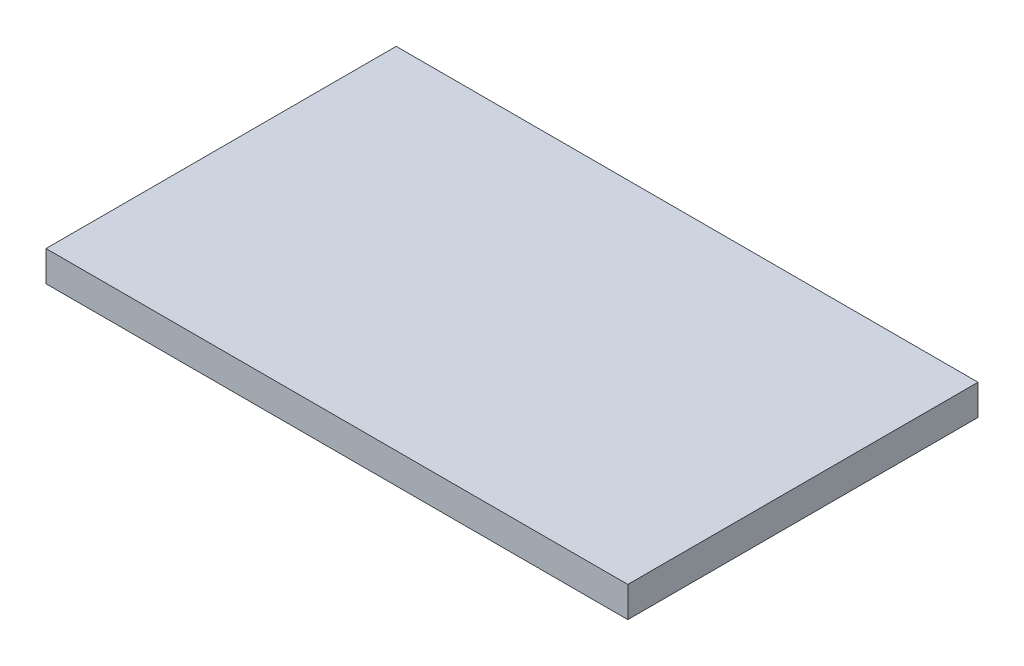
ISO-10303-21;
HEADER;
FILE_DESCRIPTION(('STEP AP214'),'2;1');
FILE_NAME('part.step','',(''),(''),'','','');
FILE_SCHEMA(('AUTOMOTIVE_DESIGN { 1 0 10303 214 1 1 1 1 }'));
ENDSEC;
DATA;
#1=APPLICATION_CONTEXT('core data for automotive mechanical design processes');
#2=APPLICATION_PROTOCOL_DEFINITION('international standard','automotive_design',2000,#1);
#3=PRODUCT_CONTEXT('',#1,'mechanical');
#4=PRODUCT('Part','Part','',(#3));
#5=PRODUCT_RELATED_PRODUCT_CATEGORY('part','',(#4));
#6=PRODUCT_DEFINITION_FORMATION('','',#4);
#7=PRODUCT_DEFINITION_CONTEXT('part definition',#1,'design');
#8=PRODUCT_DEFINITION('design','',#6,#7);
#9=PRODUCT_DEFINITION_SHAPE('','',#8);
#10=(LENGTH_UNIT() NAMED_UNIT(*) SI_UNIT(.MILLI.,.METRE.));
#11=(NAMED_UNIT(*) PLANE_ANGLE_UNIT() SI_UNIT($,.RADIAN.));
#12=(NAMED_UNIT(*) SI_UNIT($,.STERADIAN.) SOLID_ANGLE_UNIT());
#13=UNCERTAINTY_MEASURE_WITH_UNIT(LENGTH_MEASURE(1.E-05),#10,'distance_accuracy_value','');
#14=(GEOMETRIC_REPRESENTATION_CONTEXT(3) GLOBAL_UNCERTAINTY_ASSIGNED_CONTEXT((#13)) GLOBAL_UNIT_ASSIGNED_CONTEXT((#10,
#11,#12)) REPRESENTATION_CONTEXT('',''));
#15=CARTESIAN_POINT('',(0.,0.,0.));
#16=DIRECTION('',(0.,0.,1.));
#17=DIRECTION('',(1.,0.,0.));
#18=AXIS2_PLACEMENT_3D('',#15,#16,#17);
#19=CARTESIAN_POINT('',(-95.3262209228999,10.,57.3782998715129));
#20=DIRECTION('',(1.,0.,0.));
#21=DIRECTION('',(0.,0.,-1.));
#22=AXIS2_PLACEMENT_3D('',#19,#20,#21);
#23=PLANE('',#22);
#24=DIRECTION('',(0.,0.,1.));
#25=VECTOR('',#24,1.);
#26=CARTESIAN_POINT('',(-95.3262209228999,0.,57.3782998715129));
#27=LINE('',#26,#25);
#28=CARTESIAN_POINT('',(-95.3262209228999,0.,-57.3782998715129));
#29=VERTEX_POINT('',#28);
#30=CARTESIAN_POINT('',(-95.3262209228999,0.,57.3782998715129));
#31=VERTEX_POINT('',#30);
#32=EDGE_CURVE('E96',#29,#31,#27,.T.);
#33=ORIENTED_EDGE('',*,*,#32,.T.);
#34=DIRECTION('',(0.,-1.,0.));
#35=VECTOR('',#34,1.);
#36=CARTESIAN_POINT('',(-95.3262209228999,10.,57.3782998715129));
#37=LINE('',#36,#35);
#38=CARTESIAN_POINT('',(-95.3262209228999,10.,57.3782998715129));
#39=VERTEX_POINT('',#38);
#40=EDGE_CURVE('E11',#39,#31,#37,.T.);
#41=ORIENTED_EDGE('',*,*,#40,.F.);
#42=DIRECTION('',(0.,0.,1.));
#43=VECTOR('',#42,1.);
#44=CARTESIAN_POINT('',(-95.3262209228999,10.,57.3782998715129));
#45=LINE('',#44,#43);
#46=CARTESIAN_POINT('',(-95.3262209228999,10.,-57.3782998715129));
#47=VERTEX_POINT('',#46);
#48=EDGE_CURVE('E84',#47,#39,#45,.T.);
#49=ORIENTED_EDGE('',*,*,#48,.F.);
#50=DIRECTION('',(0.,-1.,0.));
#51=VECTOR('',#50,1.);
#52=CARTESIAN_POINT('',(-95.3262209228999,10.,-57.3782998715129));
#53=LINE('',#52,#51);
#54=EDGE_CURVE('E92',#47,#29,#53,.T.);
#55=ORIENTED_EDGE('',*,*,#54,.T.);
#56=EDGE_LOOP('',(#33,#41,#49,#55));
#57=FACE_BOUND('',#56,.T.);
#58=ADVANCED_FACE('F33',(#57),#23,.F.);
#59=CARTESIAN_POINT('',(95.3262209228999,10.,57.3782998715129));
#60=DIRECTION('',(0.,0.,-1.));
#61=DIRECTION('',(-1.,0.,0.));
#62=AXIS2_PLACEMENT_3D('',#59,#60,#61);
#63=PLANE('',#62);
#64=DIRECTION('',(1.,0.,0.));
#65=VECTOR('',#64,1.);
#66=CARTESIAN_POINT('',(95.3262209228999,0.,57.3782998715129));
#67=LINE('',#66,#65);
#68=CARTESIAN_POINT('',(95.3262209228999,0.,57.3782998715129));
#69=VERTEX_POINT('',#68);
#70=EDGE_CURVE('E88',#31,#69,#67,.T.);
#71=ORIENTED_EDGE('',*,*,#70,.T.);
#72=DIRECTION('',(0.,-1.,0.));
#73=VECTOR('',#72,1.);
#74=CARTESIAN_POINT('',(95.3262209228999,10.,57.3782998715129));
#75=LINE('',#74,#73);
#76=CARTESIAN_POINT('',(95.3262209228999,10.,57.3782998715129));
#77=VERTEX_POINT('',#76);
#78=EDGE_CURVE('E41',#77,#69,#75,.T.);
#79=ORIENTED_EDGE('',*,*,#78,.F.);
#80=DIRECTION('',(1.,0.,0.));
#81=VECTOR('',#80,1.);
#82=CARTESIAN_POINT('',(95.3262209228999,10.,57.3782998715129));
#83=LINE('',#82,#81);
#84=EDGE_CURVE('E79',#39,#77,#83,.T.);
#85=ORIENTED_EDGE('',*,*,#84,.F.);
#86=ORIENTED_EDGE('',*,*,#40,.T.);
#87=EDGE_LOOP('',(#71,#79,#85,#86));
#88=FACE_BOUND('',#87,.T.);
#89=ADVANCED_FACE('F87',(#88),#63,.F.);
#90=CARTESIAN_POINT('',(95.3262209228999,10.,57.3782998715129));
#91=DIRECTION('',(-1.,0.,0.));
#92=DIRECTION('',(0.,0.,1.));
#93=AXIS2_PLACEMENT_3D('',#90,#91,#92);
#94=PLANE('',#93);
#95=DIRECTION('',(0.,0.,-1.));
#96=VECTOR('',#95,1.);
#97=CARTESIAN_POINT('',(95.3262209228999,0.,57.3782998715129));
#98=LINE('',#97,#96);
#99=CARTESIAN_POINT('',(95.3262209228999,0.,-57.3782998715129));
#100=VERTEX_POINT('',#99);
#101=EDGE_CURVE('E66',#69,#100,#98,.T.);
#102=ORIENTED_EDGE('',*,*,#101,.T.);
#103=DIRECTION('',(0.,-1.,0.));
#104=VECTOR('',#103,1.);
#105=CARTESIAN_POINT('',(95.3262209228999,10.,-57.3782998715129));
#106=LINE('',#105,#104);
#107=CARTESIAN_POINT('',(95.3262209228999,10.,-57.3782998715129));
#108=VERTEX_POINT('',#107);
#109=EDGE_CURVE('E89',#108,#100,#106,.T.);
#110=ORIENTED_EDGE('',*,*,#109,.F.);
#111=DIRECTION('',(0.,0.,-1.));
#112=VECTOR('',#111,1.);
#113=CARTESIAN_POINT('',(95.3262209228999,10.,57.3782998715129));
#114=LINE('',#113,#112);
#115=EDGE_CURVE('E82',#77,#108,#114,.T.);
#116=ORIENTED_EDGE('',*,*,#115,.F.);
#117=ORIENTED_EDGE('',*,*,#78,.T.);
#118=EDGE_LOOP('',(#102,#110,#116,#117));
#119=FACE_BOUND('',#118,.T.);
#120=ADVANCED_FACE('F90',(#119),#94,.F.);
#121=CARTESIAN_POINT('',(95.3262209228999,10.,-57.3782998715129));
#122=DIRECTION('',(0.,0.,1.));
#123=DIRECTION('',(1.,0.,0.));
#124=AXIS2_PLACEMENT_3D('',#121,#122,#123);
#125=PLANE('',#124);
#126=DIRECTION('',(-1.,0.,0.));
#127=VECTOR('',#126,1.);
#128=CARTESIAN_POINT('',(95.3262209228999,0.,-57.3782998715129));
#129=LINE('',#128,#127);
#130=EDGE_CURVE('E72',#100,#29,#129,.T.);
#131=ORIENTED_EDGE('',*,*,#130,.T.);
#132=ORIENTED_EDGE('',*,*,#54,.F.);
#133=DIRECTION('',(-1.,0.,0.));
#134=VECTOR('',#133,1.);
#135=CARTESIAN_POINT('',(95.3262209228999,10.,-57.3782998715129));
#136=LINE('',#135,#134);
#137=EDGE_CURVE('E49',#108,#47,#136,.T.);
#138=ORIENTED_EDGE('',*,*,#137,.F.);
#139=ORIENTED_EDGE('',*,*,#109,.T.);
#140=EDGE_LOOP('',(#131,#132,#138,#139));
#141=FACE_BOUND('',#140,.T.);
#142=ADVANCED_FACE('F103',(#141),#125,.F.);
#143=CARTESIAN_POINT('',(0.,10.,0.));
#144=DIRECTION('',(0.,1.,0.));
#145=DIRECTION('',(0.,0.,1.));
#146=AXIS2_PLACEMENT_3D('',#143,#144,#145);
#147=PLANE('',#146);
#148=ORIENTED_EDGE('',*,*,#48,.T.);
#149=ORIENTED_EDGE('',*,*,#84,.T.);
#150=ORIENTED_EDGE('',*,*,#115,.T.);
#151=ORIENTED_EDGE('',*,*,#137,.T.);
#152=EDGE_LOOP('',(#148,#149,#150,#151));
#153=FACE_BOUND('',#152,.T.);
#154=ADVANCED_FACE('F80',(#153),#147,.T.);
#155=CARTESIAN_POINT('',(0.,0.,0.));
#156=DIRECTION('',(0.,1.,0.));
#157=DIRECTION('',(0.,0.,1.));
#158=AXIS2_PLACEMENT_3D('',#155,#156,#157);
#159=PLANE('',#158);
#160=ORIENTED_EDGE('',*,*,#32,.F.);
#161=ORIENTED_EDGE('',*,*,#130,.F.);
#162=ORIENTED_EDGE('',*,*,#101,.F.);
#163=ORIENTED_EDGE('',*,*,#70,.F.);
#164=EDGE_LOOP('',(#160,#161,#162,#163));
#165=FACE_BOUND('',#164,.T.);
#166=ADVANCED_FACE('F106',(#165),#159,.F.);
#167=CLOSED_SHELL('',(#58,#89,#120,#142,#154,#166));
#168=MANIFOLD_SOLID_BREP('B2',#167);
#169=ADVANCED_BREP_SHAPE_REPRESENTATION('',(#18,#168),#14);
#170=SHAPE_DEFINITION_REPRESENTATION(#9,#169);
ENDSEC;
END-ISO-10303-21;
